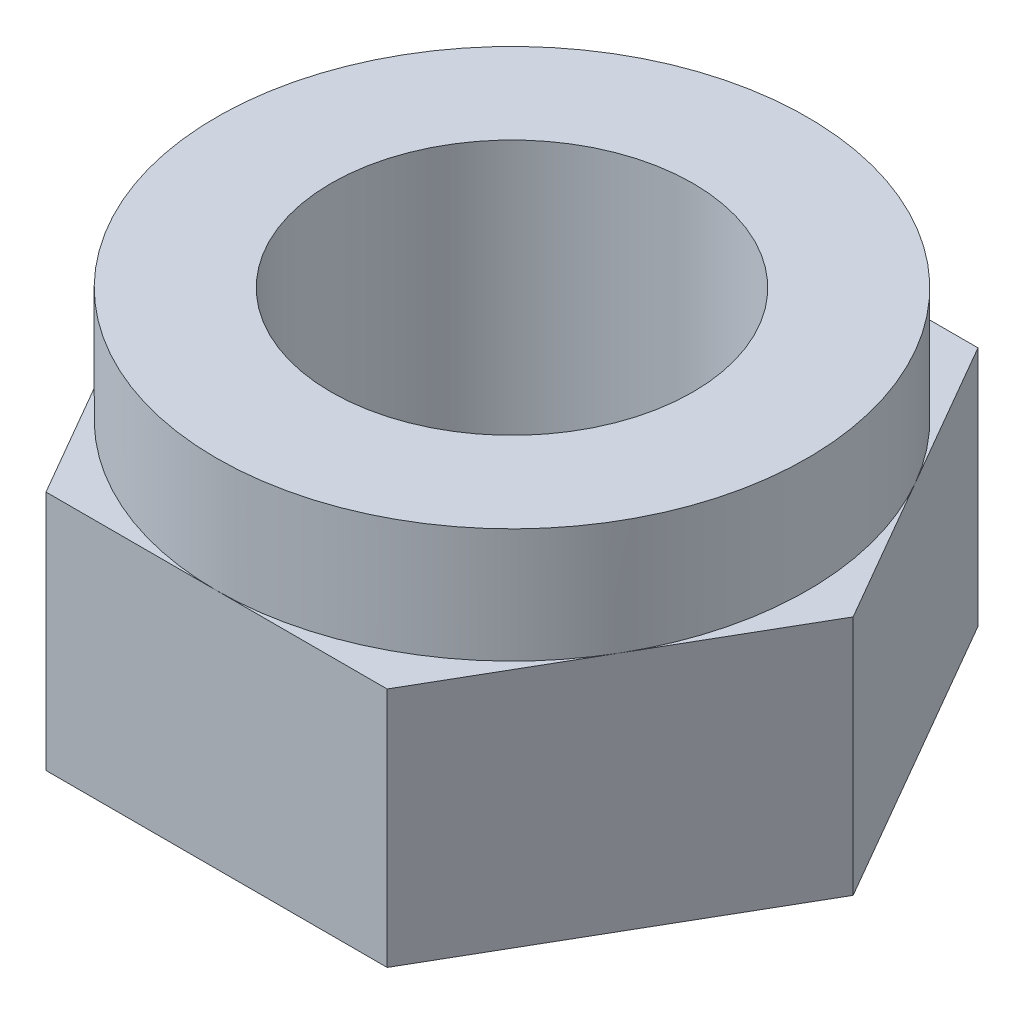
ISO-10303-21;
HEADER;
FILE_DESCRIPTION(('STEP AP214'),'2;1');
FILE_NAME('part.step','',(''),(''),'','','');
FILE_SCHEMA(('AUTOMOTIVE_DESIGN { 1 0 10303 214 1 1 1 1 }'));
ENDSEC;
DATA;
#1=APPLICATION_CONTEXT('core data for automotive mechanical design processes');
#2=APPLICATION_PROTOCOL_DEFINITION('international standard','automotive_design',2000,#1);
#3=PRODUCT_CONTEXT('',#1,'mechanical');
#4=PRODUCT('Part','Part','',(#3));
#5=PRODUCT_RELATED_PRODUCT_CATEGORY('part','',(#4));
#6=PRODUCT_DEFINITION_FORMATION('','',#4);
#7=PRODUCT_DEFINITION_CONTEXT('part definition',#1,'design');
#8=PRODUCT_DEFINITION('design','',#6,#7);
#9=PRODUCT_DEFINITION_SHAPE('','',#8);
#10=(LENGTH_UNIT() NAMED_UNIT(*) SI_UNIT(.MILLI.,.METRE.));
#11=(NAMED_UNIT(*) PLANE_ANGLE_UNIT() SI_UNIT($,.RADIAN.));
#12=(NAMED_UNIT(*) SI_UNIT($,.STERADIAN.) SOLID_ANGLE_UNIT());
#13=UNCERTAINTY_MEASURE_WITH_UNIT(LENGTH_MEASURE(1.E-05),#10,'distance_accuracy_value','');
#14=(GEOMETRIC_REPRESENTATION_CONTEXT(3) GLOBAL_UNCERTAINTY_ASSIGNED_CONTEXT((#13)) GLOBAL_UNIT_ASSIGNED_CONTEXT((#10,
#11,#12)) REPRESENTATION_CONTEXT('',''));
#15=CARTESIAN_POINT('',(0.,0.,0.));
#16=DIRECTION('',(0.,0.,1.));
#17=DIRECTION('',(1.,0.,0.));
#18=AXIS2_PLACEMENT_3D('',#15,#16,#17);
#19=CARTESIAN_POINT('',(0.,4.,0.));
#20=DIRECTION('',(0.,1.,0.));
#21=DIRECTION('',(0.,0.,1.));
#22=AXIS2_PLACEMENT_3D('',#19,#20,#21);
#23=PLANE('',#22);
#24=CARTESIAN_POINT('',(0.,4.,0.));
#25=DIRECTION('',(0.,1.,0.));
#26=DIRECTION('',(0.,0.,1.));
#27=AXIS2_PLACEMENT_3D('',#24,#25,#26);
#28=CIRCLE('',#27,4.90000000000002);
#29=CARTESIAN_POINT('',(0.,4.,4.90000000000002));
#30=VERTEX_POINT('',#29);
#31=CARTESIAN_POINT('',(4.24352447854378,4.,2.44999999999999));
#32=VERTEX_POINT('',#31);
#33=EDGE_CURVE('E46',#30,#32,#28,.T.);
#34=ORIENTED_EDGE('',*,*,#33,.F.);
#35=DIRECTION('',(1.,0.,0.));
#36=VECTOR('',#35,1.);
#37=CARTESIAN_POINT('',(-2.82901631902912,4.,4.90000000000003));
#38=LINE('',#37,#36);
#39=CARTESIAN_POINT('',(2.82901631902923,4.,4.89999999999997));
#40=VERTEX_POINT('',#39);
#41=EDGE_CURVE('E116',#30,#40,#38,.T.);
#42=ORIENTED_EDGE('',*,*,#41,.T.);
#43=DIRECTION('',(0.499999999999995,0.,-0.866025403784442));
#44=VECTOR('',#43,1.);
#45=CARTESIAN_POINT('',(2.82901631902923,4.,4.89999999999997));
#46=LINE('',#45,#44);
#47=EDGE_CURVE('E127',#40,#32,#46,.T.);
#48=ORIENTED_EDGE('',*,*,#47,.T.);
#49=EDGE_LOOP('',(#34,#42,#48));
#50=FACE_BOUND('',#49,.T.);
#51=ADVANCED_FACE('F35',(#50),#23,.T.);
#52=CARTESIAN_POINT('',(4.24352447854375,4.,-2.45000000000001));
#53=VERTEX_POINT('',#52);
#54=EDGE_CURVE('E11',#32,#53,#28,.T.);
#55=ORIENTED_EDGE('',*,*,#54,.F.);
#56=CARTESIAN_POINT('',(5.65803263805834,4.,0.));
#57=VERTEX_POINT('',#56);
#58=EDGE_CURVE('E141',#32,#57,#46,.T.);
#59=ORIENTED_EDGE('',*,*,#58,.T.);
#60=DIRECTION('',(-0.500000000000001,0.,-0.866025403784438));
#61=VECTOR('',#60,1.);
#62=CARTESIAN_POINT('',(5.65803263805834,4.,0.));
#63=LINE('',#62,#61);
#64=EDGE_CURVE('E142',#57,#53,#63,.T.);
#65=ORIENTED_EDGE('',*,*,#64,.T.);
#66=EDGE_LOOP('',(#55,#59,#65));
#67=FACE_BOUND('',#66,.T.);
#68=ADVANCED_FACE('F208',(#67),#23,.T.);
#69=CARTESIAN_POINT('',(0.,4.,-4.9));
#70=VERTEX_POINT('',#69);
#71=EDGE_CURVE('E44',#53,#70,#28,.T.);
#72=ORIENTED_EDGE('',*,*,#71,.F.);
#73=CARTESIAN_POINT('',(2.82901631902916,4.,-4.90000000000001));
#74=VERTEX_POINT('',#73);
#75=EDGE_CURVE('E140',#53,#74,#63,.T.);
#76=ORIENTED_EDGE('',*,*,#75,.T.);
#77=DIRECTION('',(-1.,0.,0.));
#78=VECTOR('',#77,1.);
#79=CARTESIAN_POINT('',(2.82901631902916,4.,-4.90000000000001));
#80=LINE('',#79,#78);
#81=EDGE_CURVE('E146',#74,#70,#80,.T.);
#82=ORIENTED_EDGE('',*,*,#81,.T.);
#83=EDGE_LOOP('',(#72,#76,#82));
#84=FACE_BOUND('',#83,.T.);
#85=ADVANCED_FACE('F203',(#84),#23,.T.);
#86=CARTESIAN_POINT('',(-4.24352447854376,4.,-2.44999999999998));
#87=VERTEX_POINT('',#86);
#88=EDGE_CURVE('E133',#70,#87,#28,.T.);
#89=ORIENTED_EDGE('',*,*,#88,.F.);
#90=CARTESIAN_POINT('',(-2.82901631902919,4.,-4.89999999999999));
#91=VERTEX_POINT('',#90);
#92=EDGE_CURVE('E145',#70,#91,#80,.T.);
#93=ORIENTED_EDGE('',*,*,#92,.T.);
#94=DIRECTION('',(-0.499999999999995,0.,0.866025403784442));
#95=VECTOR('',#94,1.);
#96=CARTESIAN_POINT('',(-2.82901631902919,4.,-4.89999999999999));
#97=LINE('',#96,#95);
#98=EDGE_CURVE('E150',#91,#87,#97,.T.);
#99=ORIENTED_EDGE('',*,*,#98,.T.);
#100=EDGE_LOOP('',(#89,#93,#99));
#101=FACE_BOUND('',#100,.T.);
#102=ADVANCED_FACE('F200',(#101),#23,.T.);
#103=CARTESIAN_POINT('',(-4.24352447854373,4.,2.45000000000004));
#104=VERTEX_POINT('',#103);
#105=EDGE_CURVE('E61',#87,#104,#28,.T.);
#106=ORIENTED_EDGE('',*,*,#105,.F.);
#107=CARTESIAN_POINT('',(-5.65803263805834,4.,0.));
#108=VERTEX_POINT('',#107);
#109=EDGE_CURVE('E149',#87,#108,#97,.T.);
#110=ORIENTED_EDGE('',*,*,#109,.T.);
#111=DIRECTION('',(0.500000000000007,0.,0.866025403784435));
#112=VECTOR('',#111,1.);
#113=CARTESIAN_POINT('',(-5.65803263805834,4.,0.));
#114=LINE('',#113,#112);
#115=EDGE_CURVE('E125',#108,#104,#114,.T.);
#116=ORIENTED_EDGE('',*,*,#115,.T.);
#117=EDGE_LOOP('',(#106,#110,#116));
#118=FACE_BOUND('',#117,.T.);
#119=ADVANCED_FACE('F198',(#118),#23,.T.);
#120=CARTESIAN_POINT('',(2.82901631902923,4.,4.89999999999997));
#121=DIRECTION('',(-0.866025403784442,0.,-0.499999999999995));
#122=DIRECTION('',(-0.499999999999995,0.,0.866025403784442));
#123=AXIS2_PLACEMENT_3D('',#120,#121,#122);
#124=PLANE('',#123);
#125=DIRECTION('',(0.499999999999995,0.,-0.866025403784442));
#126=VECTOR('',#125,1.);
#127=CARTESIAN_POINT('',(2.82901631902923,0.,4.89999999999997));
#128=LINE('',#127,#126);
#129=CARTESIAN_POINT('',(2.82901631902923,0.,4.89999999999997));
#130=VERTEX_POINT('',#129);
#131=CARTESIAN_POINT('',(5.65803263805834,0.,0.));
#132=VERTEX_POINT('',#131);
#133=EDGE_CURVE('E154',#130,#132,#128,.T.);
#134=ORIENTED_EDGE('',*,*,#133,.T.);
#135=DIRECTION('',(0.,-1.,0.));
#136=VECTOR('',#135,1.);
#137=CARTESIAN_POINT('',(5.65803263805834,4.,0.));
#138=LINE('',#137,#136);
#139=EDGE_CURVE('E39',#57,#132,#138,.T.);
#140=ORIENTED_EDGE('',*,*,#139,.F.);
#141=ORIENTED_EDGE('',*,*,#58,.F.);
#142=ORIENTED_EDGE('',*,*,#47,.F.);
#143=DIRECTION('',(0.,-1.,0.));
#144=VECTOR('',#143,1.);
#145=CARTESIAN_POINT('',(2.82901631902923,4.,4.89999999999997));
#146=LINE('',#145,#144);
#147=EDGE_CURVE('E115',#40,#130,#146,.T.);
#148=ORIENTED_EDGE('',*,*,#147,.T.);
#149=EDGE_LOOP('',(#134,#140,#141,#142,#148));
#150=FACE_BOUND('',#149,.T.);
#151=ADVANCED_FACE('F37',(#150),#124,.F.);
#152=CARTESIAN_POINT('',(5.65803263805834,4.,0.));
#153=DIRECTION('',(-0.866025403784438,0.,0.500000000000001));
#154=DIRECTION('',(0.500000000000001,0.,0.866025403784438));
#155=AXIS2_PLACEMENT_3D('',#152,#153,#154);
#156=PLANE('',#155);
#157=DIRECTION('',(-0.500000000000001,0.,-0.866025403784438));
#158=VECTOR('',#157,1.);
#159=CARTESIAN_POINT('',(5.65803263805834,0.,0.));
#160=LINE('',#159,#158);
#161=CARTESIAN_POINT('',(2.82901631902916,0.,-4.90000000000001));
#162=VERTEX_POINT('',#161);
#163=EDGE_CURVE('E157',#132,#162,#160,.T.);
#164=ORIENTED_EDGE('',*,*,#163,.T.);
#165=DIRECTION('',(0.,-1.,0.));
#166=VECTOR('',#165,1.);
#167=CARTESIAN_POINT('',(2.82901631902916,4.,-4.90000000000001));
#168=LINE('',#167,#166);
#169=EDGE_CURVE('E135',#74,#162,#168,.T.);
#170=ORIENTED_EDGE('',*,*,#169,.F.);
#171=ORIENTED_EDGE('',*,*,#75,.F.);
#172=ORIENTED_EDGE('',*,*,#64,.F.);
#173=ORIENTED_EDGE('',*,*,#139,.T.);
#174=EDGE_LOOP('',(#164,#170,#171,#172,#173));
#175=FACE_BOUND('',#174,.T.);
#176=ADVANCED_FACE('F205',(#175),#156,.F.);
#177=CARTESIAN_POINT('',(2.82901631902916,4.,-4.90000000000001));
#178=DIRECTION('',(0.,0.,1.));
#179=DIRECTION('',(1.,0.,0.));
#180=AXIS2_PLACEMENT_3D('',#177,#178,#179);
#181=PLANE('',#180);
#182=DIRECTION('',(-1.,0.,0.));
#183=VECTOR('',#182,1.);
#184=CARTESIAN_POINT('',(2.82901631902916,0.,-4.90000000000001));
#185=LINE('',#184,#183);
#186=CARTESIAN_POINT('',(-2.82901631902919,0.,-4.89999999999999));
#187=VERTEX_POINT('',#186);
#188=EDGE_CURVE('E159',#162,#187,#185,.T.);
#189=ORIENTED_EDGE('',*,*,#188,.T.);
#190=DIRECTION('',(0.,-1.,0.));
#191=VECTOR('',#190,1.);
#192=CARTESIAN_POINT('',(-2.82901631902919,4.,-4.89999999999999));
#193=LINE('',#192,#191);
#194=EDGE_CURVE('E173',#91,#187,#193,.T.);
#195=ORIENTED_EDGE('',*,*,#194,.F.);
#196=ORIENTED_EDGE('',*,*,#92,.F.);
#197=ORIENTED_EDGE('',*,*,#81,.F.);
#198=ORIENTED_EDGE('',*,*,#169,.T.);
#199=EDGE_LOOP('',(#189,#195,#196,#197,#198));
#200=FACE_BOUND('',#199,.T.);
#201=ADVANCED_FACE('F180',(#200),#181,.F.);
#202=CARTESIAN_POINT('',(-2.82901631902919,4.,-4.89999999999999));
#203=DIRECTION('',(0.866025403784442,0.,0.499999999999995));
#204=DIRECTION('',(0.499999999999995,0.,-0.866025403784442));
#205=AXIS2_PLACEMENT_3D('',#202,#203,#204);
#206=PLANE('',#205);
#207=DIRECTION('',(-0.499999999999995,0.,0.866025403784442));
#208=VECTOR('',#207,1.);
#209=CARTESIAN_POINT('',(-2.82901631902919,0.,-4.89999999999999));
#210=LINE('',#209,#208);
#211=CARTESIAN_POINT('',(-5.65803263805834,0.,0.));
#212=VERTEX_POINT('',#211);
#213=EDGE_CURVE('E161',#187,#212,#210,.T.);
#214=ORIENTED_EDGE('',*,*,#213,.T.);
#215=DIRECTION('',(0.,-1.,0.));
#216=VECTOR('',#215,1.);
#217=CARTESIAN_POINT('',(-5.65803263805834,4.,0.));
#218=LINE('',#217,#216);
#219=EDGE_CURVE('E170',#108,#212,#218,.T.);
#220=ORIENTED_EDGE('',*,*,#219,.F.);
#221=ORIENTED_EDGE('',*,*,#109,.F.);
#222=ORIENTED_EDGE('',*,*,#98,.F.);
#223=ORIENTED_EDGE('',*,*,#194,.T.);
#224=EDGE_LOOP('',(#214,#220,#221,#222,#223));
#225=FACE_BOUND('',#224,.T.);
#226=ADVANCED_FACE('F193',(#225),#206,.F.);
#227=CARTESIAN_POINT('',(-5.65803263805834,4.,0.));
#228=DIRECTION('',(0.866025403784435,0.,-0.500000000000007));
#229=DIRECTION('',(-0.500000000000007,0.,-0.866025403784434));
#230=AXIS2_PLACEMENT_3D('',#227,#228,#229);
#231=PLANE('',#230);
#232=DIRECTION('',(0.500000000000007,0.,0.866025403784435));
#233=VECTOR('',#232,1.);
#234=CARTESIAN_POINT('',(-5.65803263805834,0.,0.));
#235=LINE('',#234,#233);
#236=CARTESIAN_POINT('',(-2.82901631902912,0.,4.90000000000003));
#237=VERTEX_POINT('',#236);
#238=EDGE_CURVE('E163',#212,#237,#235,.T.);
#239=ORIENTED_EDGE('',*,*,#238,.T.);
#240=DIRECTION('',(0.,-1.,0.));
#241=VECTOR('',#240,1.);
#242=CARTESIAN_POINT('',(-2.82901631902912,4.,4.90000000000003));
#243=LINE('',#242,#241);
#244=CARTESIAN_POINT('',(-2.82901631902912,4.,4.90000000000003));
#245=VERTEX_POINT('',#244);
#246=EDGE_CURVE('E168',#245,#237,#243,.T.);
#247=ORIENTED_EDGE('',*,*,#246,.F.);
#248=EDGE_CURVE('E111',#104,#245,#114,.T.);
#249=ORIENTED_EDGE('',*,*,#248,.F.);
#250=ORIENTED_EDGE('',*,*,#115,.F.);
#251=ORIENTED_EDGE('',*,*,#219,.T.);
#252=EDGE_LOOP('',(#239,#247,#249,#250,#251));
#253=FACE_BOUND('',#252,.T.);
#254=ADVANCED_FACE('F197',(#253),#231,.F.);
#255=CARTESIAN_POINT('',(-2.82901631902912,4.,4.90000000000003));
#256=DIRECTION('',(0.,0.,-1.));
#257=DIRECTION('',(-1.,0.,0.));
#258=AXIS2_PLACEMENT_3D('',#255,#256,#257);
#259=PLANE('',#258);
#260=DIRECTION('',(1.,0.,0.));
#261=VECTOR('',#260,1.);
#262=CARTESIAN_POINT('',(-2.82901631902912,0.,4.90000000000003));
#263=LINE('',#262,#261);
#264=EDGE_CURVE('E165',#237,#130,#263,.T.);
#265=ORIENTED_EDGE('',*,*,#264,.T.);
#266=ORIENTED_EDGE('',*,*,#147,.F.);
#267=ORIENTED_EDGE('',*,*,#41,.F.);
#268=EDGE_CURVE('E108',#245,#30,#38,.T.);
#269=ORIENTED_EDGE('',*,*,#268,.F.);
#270=ORIENTED_EDGE('',*,*,#246,.T.);
#271=EDGE_LOOP('',(#265,#266,#267,#269,#270));
#272=FACE_BOUND('',#271,.T.);
#273=ADVANCED_FACE('F120',(#272),#259,.F.);
#274=EDGE_CURVE('E53',#104,#30,#28,.T.);
#275=ORIENTED_EDGE('',*,*,#274,.F.);
#276=ORIENTED_EDGE('',*,*,#248,.T.);
#277=ORIENTED_EDGE('',*,*,#268,.T.);
#278=EDGE_LOOP('',(#275,#276,#277));
#279=FACE_BOUND('',#278,.T.);
#280=ADVANCED_FACE('F110',(#279),#23,.T.);
#281=CARTESIAN_POINT('',(0.,0.,0.));
#282=DIRECTION('',(0.,1.,0.));
#283=DIRECTION('',(0.,0.,1.));
#284=AXIS2_PLACEMENT_3D('',#281,#282,#283);
#285=PLANE('',#284);
#286=CARTESIAN_POINT('',(0.,0.,0.));
#287=DIRECTION('',(0.,1.,0.));
#288=DIRECTION('',(0.,0.,1.));
#289=AXIS2_PLACEMENT_3D('',#286,#287,#288);
#290=CIRCLE('',#289,3.);
#291=CARTESIAN_POINT('',(0.,0.,3.));
#292=VERTEX_POINT('',#291);
#293=EDGE_CURVE('E303',#292,#292,#290,.T.);
#294=ORIENTED_EDGE('',*,*,#293,.T.);
#295=EDGE_LOOP('',(#294));
#296=FACE_BOUND('',#295,.T.);
#297=ORIENTED_EDGE('',*,*,#133,.F.);
#298=ORIENTED_EDGE('',*,*,#264,.F.);
#299=ORIENTED_EDGE('',*,*,#238,.F.);
#300=ORIENTED_EDGE('',*,*,#213,.F.);
#301=ORIENTED_EDGE('',*,*,#188,.F.);
#302=ORIENTED_EDGE('',*,*,#163,.F.);
#303=EDGE_LOOP('',(#297,#298,#299,#300,#301,#302));
#304=FACE_BOUND('',#303,.T.);
#305=ADVANCED_FACE('F188',(#296,#304),#285,.F.);
#306=CARTESIAN_POINT('',(0.,5.9,0.));
#307=DIRECTION('',(0.,-1.,0.));
#308=DIRECTION('',(0.,0.,-1.));
#309=AXIS2_PLACEMENT_3D('',#306,#307,#308);
#310=CYLINDRICAL_SURFACE('',#309,4.90000000000002);
#311=CARTESIAN_POINT('',(0.,5.9,0.));
#312=DIRECTION('',(0.,1.,0.));
#313=DIRECTION('',(0.,0.,1.));
#314=AXIS2_PLACEMENT_3D('',#311,#312,#313);
#315=CIRCLE('',#314,4.90000000000002);
#316=CARTESIAN_POINT('',(0.,5.9,4.90000000000002));
#317=VERTEX_POINT('',#316);
#318=EDGE_CURVE('E129',#317,#317,#315,.T.);
#319=ORIENTED_EDGE('',*,*,#318,.F.);
#320=EDGE_LOOP('',(#319));
#321=FACE_BOUND('',#320,.T.);
#322=ORIENTED_EDGE('',*,*,#33,.T.);
#323=ORIENTED_EDGE('',*,*,#54,.T.);
#324=ORIENTED_EDGE('',*,*,#71,.T.);
#325=ORIENTED_EDGE('',*,*,#88,.T.);
#326=ORIENTED_EDGE('',*,*,#105,.T.);
#327=ORIENTED_EDGE('',*,*,#274,.T.);
#328=EDGE_LOOP('',(#322,#323,#324,#325,#326,#327));
#329=FACE_BOUND('',#328,.T.);
#330=ADVANCED_FACE('F131',(#321,#329),#310,.T.);
#331=CARTESIAN_POINT('',(0.,5.9,0.));
#332=DIRECTION('',(0.,1.,0.));
#333=DIRECTION('',(0.,0.,1.));
#334=AXIS2_PLACEMENT_3D('',#331,#332,#333);
#335=PLANE('',#334);
#336=CARTESIAN_POINT('',(0.,5.9,0.));
#337=DIRECTION('',(0.,1.,0.));
#338=DIRECTION('',(0.,0.,1.));
#339=AXIS2_PLACEMENT_3D('',#336,#337,#338);
#340=CIRCLE('',#339,3.);
#341=CARTESIAN_POINT('',(0.,5.9,3.));
#342=VERTEX_POINT('',#341);
#343=EDGE_CURVE('E130',#342,#342,#340,.T.);
#344=ORIENTED_EDGE('',*,*,#343,.F.);
#345=EDGE_LOOP('',(#344));
#346=FACE_BOUND('',#345,.T.);
#347=ORIENTED_EDGE('',*,*,#318,.T.);
#348=EDGE_LOOP('',(#347));
#349=FACE_BOUND('',#348,.T.);
#350=ADVANCED_FACE('F268',(#346,#349),#335,.T.);
#351=CARTESIAN_POINT('',(0.,5.901,0.));
#352=DIRECTION('',(0.,-1.,0.));
#353=DIRECTION('',(0.,0.,-1.));
#354=AXIS2_PLACEMENT_3D('',#351,#352,#353);
#355=CYLINDRICAL_SURFACE('',#354,3.);
#356=ORIENTED_EDGE('',*,*,#343,.T.);
#357=EDGE_LOOP('',(#356));
#358=FACE_BOUND('',#357,.T.);
#359=ORIENTED_EDGE('',*,*,#293,.F.);
#360=EDGE_LOOP('',(#359));
#361=FACE_BOUND('',#360,.T.);
#362=ADVANCED_FACE('F284',(#358,#361),#355,.F.);
#363=CLOSED_SHELL('',(#51,#68,#85,#102,#119,#151,#176,#201,#226,#254,#273,#280,#305,#330,#350,#362));
#364=MANIFOLD_SOLID_BREP('B2',#363);
#365=ADVANCED_BREP_SHAPE_REPRESENTATION('',(#18,#364),#14);
#366=SHAPE_DEFINITION_REPRESENTATION(#9,#365);
ENDSEC;
END-ISO-10303-21;
